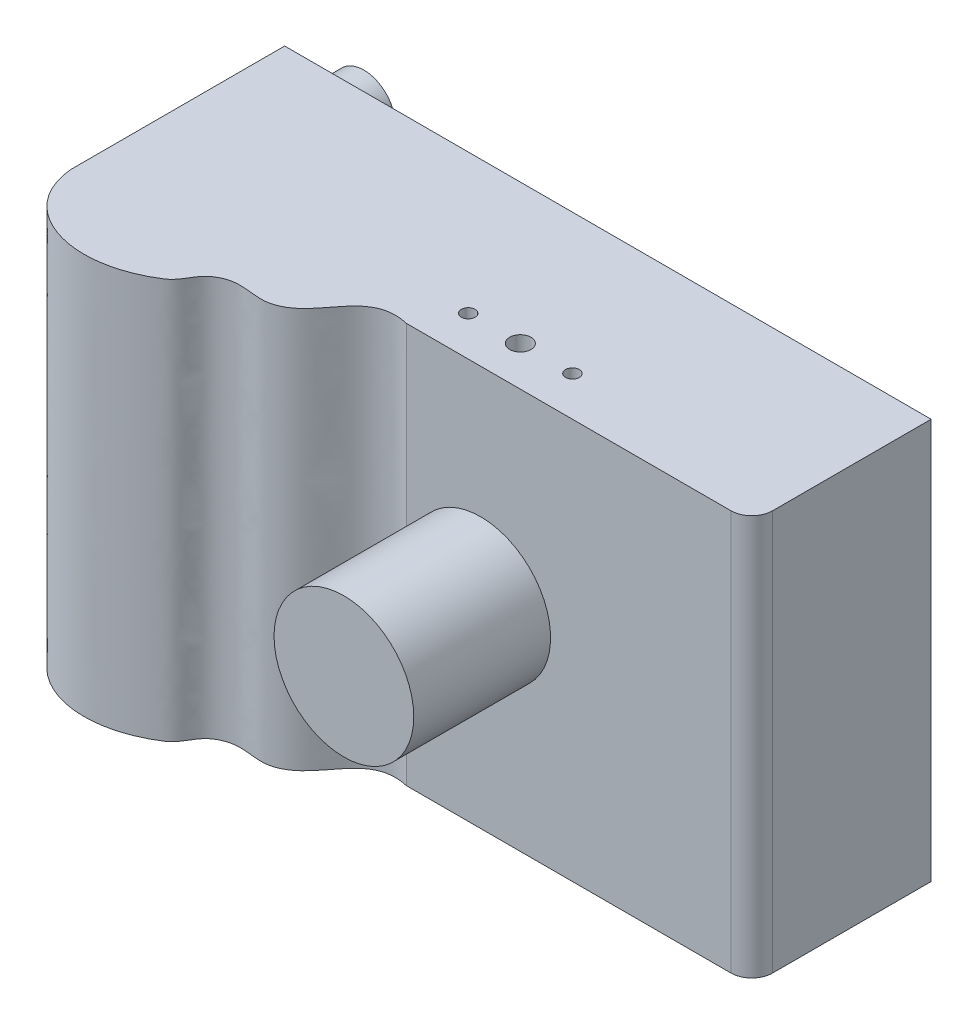
ISO-10303-21;
HEADER;
FILE_DESCRIPTION(('STEP AP214'),'2;1');
FILE_NAME('part.step','',(''),(''),'','','');
FILE_SCHEMA(('AUTOMOTIVE_DESIGN { 1 0 10303 214 1 1 1 1 }'));
ENDSEC;
DATA;
#1=APPLICATION_CONTEXT('core data for automotive mechanical design processes');
#2=APPLICATION_PROTOCOL_DEFINITION('international standard','automotive_design',2000,#1);
#3=PRODUCT_CONTEXT('',#1,'mechanical');
#4=PRODUCT('Part','Part','',(#3));
#5=PRODUCT_RELATED_PRODUCT_CATEGORY('part','',(#4));
#6=PRODUCT_DEFINITION_FORMATION('','',#4);
#7=PRODUCT_DEFINITION_CONTEXT('part definition',#1,'design');
#8=PRODUCT_DEFINITION('design','',#6,#7);
#9=PRODUCT_DEFINITION_SHAPE('','',#8);
#10=(LENGTH_UNIT() NAMED_UNIT(*) SI_UNIT(.MILLI.,.METRE.));
#11=(NAMED_UNIT(*) PLANE_ANGLE_UNIT() SI_UNIT($,.RADIAN.));
#12=(NAMED_UNIT(*) SI_UNIT($,.STERADIAN.) SOLID_ANGLE_UNIT());
#13=UNCERTAINTY_MEASURE_WITH_UNIT(LENGTH_MEASURE(1.E-05),#10,'distance_accuracy_value','');
#14=(GEOMETRIC_REPRESENTATION_CONTEXT(3) GLOBAL_UNCERTAINTY_ASSIGNED_CONTEXT((#13)) GLOBAL_UNIT_ASSIGNED_CONTEXT((#10,
#11,#12)) REPRESENTATION_CONTEXT('',''));
#15=CARTESIAN_POINT('',(0.,0.,0.));
#16=DIRECTION('',(0.,0.,1.));
#17=DIRECTION('',(1.,0.,0.));
#18=AXIS2_PLACEMENT_3D('',#15,#16,#17);
#19=CARTESIAN_POINT('',(-77.5,96.,-33.7133745413593));
#20=DIRECTION('',(1.,0.,0.));
#21=DIRECTION('',(0.,0.,-1.));
#22=AXIS2_PLACEMENT_3D('',#19,#20,#21);
#23=PLANE('',#22);
#24=CARTESIAN_POINT('',(-77.5,85.,-0.213374541359251));
#25=DIRECTION('',(-1.,0.,0.));
#26=DIRECTION('',(0.,0.,1.));
#27=AXIS2_PLACEMENT_3D('',#24,#25,#26);
#28=CIRCLE('',#27,1.65);
#29=CARTESIAN_POINT('',(-77.5,85.,1.43662545864075));
#30=VERTEX_POINT('',#29);
#31=EDGE_CURVE('E208',#30,#30,#28,.T.);
#32=ORIENTED_EDGE('',*,*,#31,.F.);
#33=EDGE_LOOP('',(#32));
#34=FACE_BOUND('',#33,.T.);
#35=CARTESIAN_POINT('',(-77.5,10.,-0.213374541359251));
#36=DIRECTION('',(-1.,0.,0.));
#37=DIRECTION('',(0.,0.,1.));
#38=AXIS2_PLACEMENT_3D('',#35,#36,#37);
#39=CIRCLE('',#38,1.65);
#40=CARTESIAN_POINT('',(-77.5,10.,1.43662545864075));
#41=VERTEX_POINT('',#40);
#42=EDGE_CURVE('E212',#41,#41,#39,.T.);
#43=ORIENTED_EDGE('',*,*,#42,.F.);
#44=EDGE_LOOP('',(#43));
#45=FACE_BOUND('',#44,.T.);
#46=CARTESIAN_POINT('',(-77.5,47.5,-0.213374541359251));
#47=DIRECTION('',(-1.,0.,0.));
#48=DIRECTION('',(0.,0.,1.));
#49=AXIS2_PLACEMENT_3D('',#46,#47,#48);
#50=CIRCLE('',#49,2.5527);
#51=CARTESIAN_POINT('',(-77.5,47.5,2.33932545864075));
#52=VERTEX_POINT('',#51);
#53=EDGE_CURVE('E215',#52,#52,#50,.T.);
#54=ORIENTED_EDGE('',*,*,#53,.F.);
#55=EDGE_LOOP('',(#54));
#56=FACE_BOUND('',#55,.T.);
#57=DIRECTION('',(0.,0.,1.));
#58=VECTOR('',#57,1.);
#59=CARTESIAN_POINT('',(-77.5,0.,-33.7133745413593));
#60=LINE('',#59,#58);
#61=CARTESIAN_POINT('',(-77.5,0.,-33.7133745413593));
#62=VERTEX_POINT('',#61);
#63=CARTESIAN_POINT('',(-77.5,0.,17.5926323335898));
#64=VERTEX_POINT('',#63);
#65=EDGE_CURVE('E134',#62,#64,#60,.T.);
#66=ORIENTED_EDGE('',*,*,#65,.T.);
#67=DIRECTION('',(0.,-1.,0.));
#68=VECTOR('',#67,1.);
#69=CARTESIAN_POINT('',(-77.5,96.,17.5926323335898));
#70=LINE('',#69,#68);
#71=CARTESIAN_POINT('',(-77.5,96.,17.5926323335898));
#72=VERTEX_POINT('',#71);
#73=EDGE_CURVE('E167',#72,#64,#70,.T.);
#74=ORIENTED_EDGE('',*,*,#73,.F.);
#75=DIRECTION('',(0.,0.,1.));
#76=VECTOR('',#75,1.);
#77=CARTESIAN_POINT('',(-77.5,96.,-33.7133745413593));
#78=LINE('',#77,#76);
#79=CARTESIAN_POINT('',(-77.5,96.,-33.7133745413593));
#80=VERTEX_POINT('',#79);
#81=EDGE_CURVE('E156',#80,#72,#78,.T.);
#82=ORIENTED_EDGE('',*,*,#81,.F.);
#83=DIRECTION('',(0.,-1.,0.));
#84=VECTOR('',#83,1.);
#85=CARTESIAN_POINT('',(-77.5,96.,-33.7133745413593));
#86=LINE('',#85,#84);
#87=EDGE_CURVE('E130',#80,#62,#86,.T.);
#88=ORIENTED_EDGE('',*,*,#87,.T.);
#89=EDGE_LOOP('',(#66,#74,#82,#88));
#90=FACE_BOUND('',#89,.T.);
#91=ADVANCED_FACE('F41',(#34,#45,#56,#90),#23,.F.);
#92=CARTESIAN_POINT('',(-77.5,96.,17.5926323335898));
#93=CARTESIAN_POINT('',(-76.5315869213499,96.,27.8123647059784));
#94=CARTESIAN_POINT('',(-63.183365133086,96.,36.2255266432069));
#95=CARTESIAN_POINT('',(-48.309869967326,96.,32.1915608013237));
#96=CARTESIAN_POINT('',(-41.5482213944993,96.,27.7915772785993));
#97=CARTESIAN_POINT('',(-39.9233173070363,96.,23.2528904065731));
#98=CARTESIAN_POINT('',(-33.5165916900151,96.,20.4028040792528));
#99=CARTESIAN_POINT('',(-27.63682193127,96.,22.4572797434264));
#100=CARTESIAN_POINT('',(-17.0164943439837,96.,17.9926335701171));
#101=CARTESIAN_POINT('',(-15.4514686909685,96.,6.93162842245507));
#102=CARTESIAN_POINT('',(-5.34280428989304,96.,9.28662545864075));
#103=B_SPLINE_CURVE_WITH_KNOTS('',3,(#92,#93,#94,#95,#96,#97,#98,#99,#100,#101,#102),
.UNSPECIFIED.,.F.,.F.,(4,1,1,1,1,1,1,1,4),(0.,0.287416321184305,0.468367966268484,
0.496457190712018,0.560076212974291,0.621962161595388,0.714917343398647,0.759402269594199,1.),.UNSPECIFIED.);
#104=DIRECTION('',(0.,-1.,0.));
#105=VECTOR('',#104,1.);
#106=SURFACE_OF_LINEAR_EXTRUSION('',#103,#105);
#107=CARTESIAN_POINT('',(-77.5,0.,17.5926323335898));
#108=CARTESIAN_POINT('',(-76.5315869213499,0.,27.8123647059784));
#109=CARTESIAN_POINT('',(-63.183365133086,0.,36.2255266432069));
#110=CARTESIAN_POINT('',(-48.309869967326,0.,32.1915608013237));
#111=CARTESIAN_POINT('',(-41.5482213944993,0.,27.7915772785993));
#112=CARTESIAN_POINT('',(-39.9233173070363,0.,23.2528904065731));
#113=CARTESIAN_POINT('',(-33.5165916900151,0.,20.4028040792528));
#114=CARTESIAN_POINT('',(-27.63682193127,0.,22.4572797434264));
#115=CARTESIAN_POINT('',(-17.0164943439837,0.,17.9926335701171));
#116=CARTESIAN_POINT('',(-15.4514686909685,0.,6.93162842245507));
#117=CARTESIAN_POINT('',(-5.34280428989304,0.,9.28662545864075));
#118=B_SPLINE_CURVE_WITH_KNOTS('',3,(#107,#108,#109,#110,#111,#112,#113,#114,#115,#116,#117),
.UNSPECIFIED.,.F.,.F.,(4,1,1,1,1,1,1,1,4),(0.,0.287416321184305,0.468367966268484,
0.496457190712018,0.560076212974291,0.621962161595388,0.714917343398647,0.759402269594199,1.),.UNSPECIFIED.);
#119=CARTESIAN_POINT('',(-5.34280428989305,0.,9.28662545864074));
#120=VERTEX_POINT('',#119);
#121=EDGE_CURVE('E138',#64,#120,#118,.T.);
#122=ORIENTED_EDGE('',*,*,#121,.T.);
#123=DIRECTION('',(0.,-1.,0.));
#124=VECTOR('',#123,1.);
#125=CARTESIAN_POINT('',(-5.34280428989305,96.,9.28662545864074));
#126=LINE('',#125,#124);
#127=CARTESIAN_POINT('',(-5.34280428989305,96.,9.28662545864074));
#128=VERTEX_POINT('',#127);
#129=EDGE_CURVE('E163',#128,#120,#126,.T.);
#130=ORIENTED_EDGE('',*,*,#129,.F.);
#131=EDGE_CURVE('E97',#72,#128,#103,.T.);
#132=ORIENTED_EDGE('',*,*,#131,.F.);
#133=ORIENTED_EDGE('',*,*,#73,.T.);
#134=EDGE_LOOP('',(#122,#130,#132,#133));
#135=FACE_BOUND('',#134,.T.);
#136=ADVANCED_FACE('F178',(#135),#106,.F.);
#137=CARTESIAN_POINT('',(72.5,96.,9.28662545864074));
#138=DIRECTION('',(0.,0.,-1.));
#139=DIRECTION('',(-1.,0.,0.));
#140=AXIS2_PLACEMENT_3D('',#137,#138,#139);
#141=PLANE('',#140);
#142=CARTESIAN_POINT('',(12.5,48.,9.28662545864074));
#143=DIRECTION('',(0.,0.,-1.));
#144=DIRECTION('',(-1.,0.,0.));
#145=AXIS2_PLACEMENT_3D('',#142,#143,#144);
#146=CIRCLE('',#145,16.75);
#147=CARTESIAN_POINT('',(-4.25,48.,9.28662545864074));
#148=VERTEX_POINT('',#147);
#149=EDGE_CURVE('E50',#148,#148,#146,.F.);
#150=ORIENTED_EDGE('',*,*,#149,.F.);
#151=EDGE_LOOP('',(#150));
#152=FACE_BOUND('',#151,.T.);
#153=DIRECTION('',(1.,0.,0.));
#154=VECTOR('',#153,1.);
#155=CARTESIAN_POINT('',(72.5,0.,9.28662545864074));
#156=LINE('',#155,#154);
#157=CARTESIAN_POINT('',(72.5,0.,9.28662545864075));
#158=VERTEX_POINT('',#157);
#159=EDGE_CURVE('E144',#120,#158,#156,.T.);
#160=ORIENTED_EDGE('',*,*,#159,.T.);
#161=DIRECTION('',(0.,-1.,0.));
#162=VECTOR('',#161,1.);
#163=CARTESIAN_POINT('',(72.5,96.,9.28662545864075));
#164=LINE('',#163,#162);
#165=CARTESIAN_POINT('',(72.5,96.,9.28662545864075));
#166=VERTEX_POINT('',#165);
#167=EDGE_CURVE('E123',#166,#158,#164,.T.);
#168=ORIENTED_EDGE('',*,*,#167,.F.);
#169=DIRECTION('',(1.,0.,0.));
#170=VECTOR('',#169,1.);
#171=CARTESIAN_POINT('',(72.5,96.,9.28662545864074));
#172=LINE('',#171,#170);
#173=EDGE_CURVE('E112',#128,#166,#172,.T.);
#174=ORIENTED_EDGE('',*,*,#173,.F.);
#175=ORIENTED_EDGE('',*,*,#129,.T.);
#176=EDGE_LOOP('',(#160,#168,#174,#175));
#177=FACE_BOUND('',#176,.T.);
#178=ADVANCED_FACE('F175',(#152,#177),#141,.F.);
#179=CARTESIAN_POINT('',(72.5,96.,4.28662545864075));
#180=DIRECTION('',(0.,-1.,0.));
#181=DIRECTION('',(0.,0.,-1.));
#182=AXIS2_PLACEMENT_3D('',#179,#180,#181);
#183=CYLINDRICAL_SURFACE('',#182,5.);
#184=CARTESIAN_POINT('',(72.5,0.,4.28662545864075));
#185=DIRECTION('',(0.,1.,0.));
#186=DIRECTION('',(0.,0.,1.));
#187=AXIS2_PLACEMENT_3D('',#184,#185,#186);
#188=CIRCLE('',#187,5.);
#189=CARTESIAN_POINT('',(77.5,0.,4.28662545864074));
#190=VERTEX_POINT('',#189);
#191=EDGE_CURVE('E121',#158,#190,#188,.T.);
#192=ORIENTED_EDGE('',*,*,#191,.T.);
#193=DIRECTION('',(0.,-1.,0.));
#194=VECTOR('',#193,1.);
#195=CARTESIAN_POINT('',(77.5,96.,4.28662545864074));
#196=LINE('',#195,#194);
#197=CARTESIAN_POINT('',(77.5,96.,4.28662545864074));
#198=VERTEX_POINT('',#197);
#199=EDGE_CURVE('E118',#198,#190,#196,.T.);
#200=ORIENTED_EDGE('',*,*,#199,.F.);
#201=CARTESIAN_POINT('',(72.5,96.,4.28662545864075));
#202=DIRECTION('',(0.,1.,0.));
#203=DIRECTION('',(0.,0.,1.));
#204=AXIS2_PLACEMENT_3D('',#201,#202,#203);
#205=CIRCLE('',#204,5.);
#206=EDGE_CURVE('E106',#166,#198,#205,.T.);
#207=ORIENTED_EDGE('',*,*,#206,.F.);
#208=ORIENTED_EDGE('',*,*,#167,.T.);
#209=EDGE_LOOP('',(#192,#200,#207,#208));
#210=FACE_BOUND('',#209,.T.);
#211=ADVANCED_FACE('F119',(#210),#183,.T.);
#212=CARTESIAN_POINT('',(77.5,96.,-33.7133745413593));
#213=DIRECTION('',(-1.,0.,0.));
#214=DIRECTION('',(0.,0.,1.));
#215=AXIS2_PLACEMENT_3D('',#212,#213,#214);
#216=PLANE('',#215);
#217=DIRECTION('',(0.,0.,-1.));
#218=VECTOR('',#217,1.);
#219=CARTESIAN_POINT('',(77.5,0.,-33.7133745413593));
#220=LINE('',#219,#218);
#221=CARTESIAN_POINT('',(77.5,0.,-33.7133745413593));
#222=VERTEX_POINT('',#221);
#223=EDGE_CURVE('E82',#190,#222,#220,.T.);
#224=ORIENTED_EDGE('',*,*,#223,.T.);
#225=DIRECTION('',(0.,-1.,0.));
#226=VECTOR('',#225,1.);
#227=CARTESIAN_POINT('',(77.5,96.,-33.7133745413593));
#228=LINE('',#227,#226);
#229=CARTESIAN_POINT('',(77.5,96.,-33.7133745413593));
#230=VERTEX_POINT('',#229);
#231=EDGE_CURVE('E124',#230,#222,#228,.T.);
#232=ORIENTED_EDGE('',*,*,#231,.F.);
#233=DIRECTION('',(0.,0.,-1.));
#234=VECTOR('',#233,1.);
#235=CARTESIAN_POINT('',(77.5,96.,-33.7133745413593));
#236=LINE('',#235,#234);
#237=EDGE_CURVE('E110',#198,#230,#236,.T.);
#238=ORIENTED_EDGE('',*,*,#237,.F.);
#239=ORIENTED_EDGE('',*,*,#199,.T.);
#240=EDGE_LOOP('',(#224,#232,#238,#239));
#241=FACE_BOUND('',#240,.T.);
#242=ADVANCED_FACE('F126',(#241),#216,.F.);
#243=CARTESIAN_POINT('',(-77.5,96.,-33.7133745413593));
#244=DIRECTION('',(0.,0.,1.));
#245=DIRECTION('',(1.,0.,0.));
#246=AXIS2_PLACEMENT_3D('',#243,#244,#245);
#247=PLANE('',#246);
#248=CARTESIAN_POINT('',(-66.5,85.,-33.7133745413593));
#249=DIRECTION('',(0.,0.,1.));
#250=DIRECTION('',(1.,0.,0.));
#251=AXIS2_PLACEMENT_3D('',#248,#249,#250);
#252=CIRCLE('',#251,7.50000000000001);
#253=CARTESIAN_POINT('',(-59.,85.,-33.7133745413593));
#254=VERTEX_POINT('',#253);
#255=EDGE_CURVE('E11',#254,#254,#252,.F.);
#256=ORIENTED_EDGE('',*,*,#255,.F.);
#257=EDGE_LOOP('',(#256));
#258=FACE_BOUND('',#257,.T.);
#259=DIRECTION('',(-1.,0.,0.));
#260=VECTOR('',#259,1.);
#261=CARTESIAN_POINT('',(-77.5,0.,-33.7133745413593));
#262=LINE('',#261,#260);
#263=EDGE_CURVE('E88',#222,#62,#262,.T.);
#264=ORIENTED_EDGE('',*,*,#263,.T.);
#265=ORIENTED_EDGE('',*,*,#87,.F.);
#266=DIRECTION('',(-1.,0.,0.));
#267=VECTOR('',#266,1.);
#268=CARTESIAN_POINT('',(-77.5,96.,-33.7133745413593));
#269=LINE('',#268,#267);
#270=EDGE_CURVE('E58',#230,#80,#269,.T.);
#271=ORIENTED_EDGE('',*,*,#270,.F.);
#272=ORIENTED_EDGE('',*,*,#231,.T.);
#273=EDGE_LOOP('',(#264,#265,#271,#272));
#274=FACE_BOUND('',#273,.T.);
#275=ADVANCED_FACE('F187',(#258,#274),#247,.F.);
#276=CARTESIAN_POINT('',(-42.3399997701735,96.,28.0290470153399));
#277=DIRECTION('',(0.,-1.,0.));
#278=DIRECTION('',(0.,0.,-1.));
#279=AXIS2_PLACEMENT_3D('',#276,#277,#278);
#280=PLANE('',#279);
#281=CARTESIAN_POINT('',(25.,96.,-0.213374541359251));
#282=DIRECTION('',(0.,1.,0.));
#283=DIRECTION('',(0.,0.,1.));
#284=AXIS2_PLACEMENT_3D('',#281,#282,#283);
#285=CIRCLE('',#284,1.65);
#286=CARTESIAN_POINT('',(25.,96.,1.43662545864075));
#287=VERTEX_POINT('',#286);
#288=EDGE_CURVE('E515',#287,#287,#285,.T.);
#289=ORIENTED_EDGE('',*,*,#288,.F.);
#290=EDGE_LOOP('',(#289));
#291=FACE_BOUND('',#290,.T.);
#292=CARTESIAN_POINT('',(0.,96.,-0.213374541359251));
#293=DIRECTION('',(0.,1.,0.));
#294=DIRECTION('',(0.,0.,1.));
#295=AXIS2_PLACEMENT_3D('',#292,#293,#294);
#296=CIRCLE('',#295,1.65);
#297=CARTESIAN_POINT('',(0.,96.,1.43662545864075));
#298=VERTEX_POINT('',#297);
#299=EDGE_CURVE('E525',#298,#298,#296,.T.);
#300=ORIENTED_EDGE('',*,*,#299,.F.);
#301=EDGE_LOOP('',(#300));
#302=FACE_BOUND('',#301,.T.);
#303=CARTESIAN_POINT('',(12.5,96.,-0.213374541359251));
#304=DIRECTION('',(0.,1.,0.));
#305=DIRECTION('',(0.,0.,1.));
#306=AXIS2_PLACEMENT_3D('',#303,#304,#305);
#307=CIRCLE('',#306,2.5527);
#308=CARTESIAN_POINT('',(12.5,96.,2.33932545864075));
#309=VERTEX_POINT('',#308);
#310=EDGE_CURVE('E533',#309,#309,#307,.T.);
#311=ORIENTED_EDGE('',*,*,#310,.F.);
#312=EDGE_LOOP('',(#311));
#313=FACE_BOUND('',#312,.T.);
#314=ORIENTED_EDGE('',*,*,#81,.T.);
#315=ORIENTED_EDGE('',*,*,#131,.T.);
#316=ORIENTED_EDGE('',*,*,#173,.T.);
#317=ORIENTED_EDGE('',*,*,#206,.T.);
#318=ORIENTED_EDGE('',*,*,#237,.T.);
#319=ORIENTED_EDGE('',*,*,#270,.T.);
#320=EDGE_LOOP('',(#314,#315,#316,#317,#318,#319));
#321=FACE_BOUND('',#320,.T.);
#322=ADVANCED_FACE('F108',(#291,#302,#313,#321),#280,.F.);
#323=CARTESIAN_POINT('',(-42.3399997701735,0.,28.0290470153399));
#324=DIRECTION('',(0.,-1.,0.));
#325=DIRECTION('',(0.,0.,-1.));
#326=AXIS2_PLACEMENT_3D('',#323,#324,#325);
#327=PLANE('',#326);
#328=CARTESIAN_POINT('',(0.,0.,-0.213374541359251));
#329=DIRECTION('',(0.,-1.,0.));
#330=DIRECTION('',(0.,0.,-1.));
#331=AXIS2_PLACEMENT_3D('',#328,#329,#330);
#332=CIRCLE('',#331,1.65);
#333=CARTESIAN_POINT('',(0.,0.,-1.86337454135925));
#334=VERTEX_POINT('',#333);
#335=EDGE_CURVE('E541',#334,#334,#332,.T.);
#336=ORIENTED_EDGE('',*,*,#335,.F.);
#337=EDGE_LOOP('',(#336));
#338=FACE_BOUND('',#337,.T.);
#339=CARTESIAN_POINT('',(25.,0.,-0.213374541359251));
#340=DIRECTION('',(0.,-1.,0.));
#341=DIRECTION('',(0.,0.,-1.));
#342=AXIS2_PLACEMENT_3D('',#339,#340,#341);
#343=CIRCLE('',#342,1.65);
#344=CARTESIAN_POINT('',(25.,0.,-1.86337454135925));
#345=VERTEX_POINT('',#344);
#346=EDGE_CURVE('E549',#345,#345,#343,.T.);
#347=ORIENTED_EDGE('',*,*,#346,.F.);
#348=EDGE_LOOP('',(#347));
#349=FACE_BOUND('',#348,.T.);
#350=CARTESIAN_POINT('',(12.5,0.,-10.2133745413593));
#351=DIRECTION('',(0.,-1.,0.));
#352=DIRECTION('',(0.,0.,-1.));
#353=AXIS2_PLACEMENT_3D('',#350,#351,#352);
#354=CIRCLE('',#353,2.5527);
#355=CARTESIAN_POINT('',(12.5,0.,-12.7660745413593));
#356=VERTEX_POINT('',#355);
#357=EDGE_CURVE('E557',#356,#356,#354,.T.);
#358=ORIENTED_EDGE('',*,*,#357,.F.);
#359=EDGE_LOOP('',(#358));
#360=FACE_BOUND('',#359,.T.);
#361=ORIENTED_EDGE('',*,*,#65,.F.);
#362=ORIENTED_EDGE('',*,*,#263,.F.);
#363=ORIENTED_EDGE('',*,*,#223,.F.);
#364=ORIENTED_EDGE('',*,*,#191,.F.);
#365=ORIENTED_EDGE('',*,*,#159,.F.);
#366=ORIENTED_EDGE('',*,*,#121,.F.);
#367=EDGE_LOOP('',(#361,#362,#363,#364,#365,#366));
#368=FACE_BOUND('',#367,.T.);
#369=ADVANCED_FACE('F183',(#338,#349,#360,#368),#327,.T.);
#370=CARTESIAN_POINT('',(-65.69,47.5,-0.213374541359251));
#371=DIRECTION('',(-1.,0.,0.));
#372=DIRECTION('',(0.,0.,1.));
#373=AXIS2_PLACEMENT_3D('',#370,#371,#372);
#374=CONICAL_SURFACE('',#373,2.5527,1.02974425867666);
#375=CARTESIAN_POINT('',(-64.1561830978084,47.5,-0.213374541359251));
#376=VERTEX_POINT('',#375);
#377=VERTEX_LOOP('',#376);
#378=FACE_BOUND('',#377,.T.);
#379=CARTESIAN_POINT('',(-65.69,47.5,-0.213374541359251));
#380=DIRECTION('',(-1.,0.,0.));
#381=DIRECTION('',(0.,0.,1.));
#382=AXIS2_PLACEMENT_3D('',#379,#380,#381);
#383=CIRCLE('',#382,2.5527);
#384=CARTESIAN_POINT('',(-65.69,47.5,2.33932545864075));
#385=VERTEX_POINT('',#384);
#386=EDGE_CURVE('E139',#385,#385,#383,.T.);
#387=ORIENTED_EDGE('',*,*,#386,.T.);
#388=EDGE_LOOP('',(#387));
#389=FACE_BOUND('',#388,.T.);
#390=ADVANCED_FACE('F254',(#378,#389),#374,.F.);
#391=CARTESIAN_POINT('',(-77.5,47.5,-0.213374541359251));
#392=DIRECTION('',(-1.,0.,0.));
#393=DIRECTION('',(0.,0.,1.));
#394=AXIS2_PLACEMENT_3D('',#391,#392,#393);
#395=CYLINDRICAL_SURFACE('',#394,2.5527);
#396=ORIENTED_EDGE('',*,*,#386,.F.);
#397=EDGE_LOOP('',(#396));
#398=FACE_BOUND('',#397,.T.);
#399=ORIENTED_EDGE('',*,*,#53,.T.);
#400=EDGE_LOOP('',(#399));
#401=FACE_BOUND('',#400,.T.);
#402=ADVANCED_FACE('F259',(#398,#401),#395,.F.);
#403=CARTESIAN_POINT('',(-69.5,10.,-0.213374541359251));
#404=DIRECTION('',(-1.,0.,0.));
#405=DIRECTION('',(0.,0.,1.));
#406=AXIS2_PLACEMENT_3D('',#403,#404,#405);
#407=CONICAL_SURFACE('',#406,1.65,1.02974425867665);
#408=CARTESIAN_POINT('',(-68.5085799786045,10.,-0.213374541359251));
#409=VERTEX_POINT('',#408);
#410=VERTEX_LOOP('',#409);
#411=FACE_BOUND('',#410,.T.);
#412=CARTESIAN_POINT('',(-69.5,10.,-0.213374541359251));
#413=DIRECTION('',(-1.,0.,0.));
#414=DIRECTION('',(0.,0.,1.));
#415=AXIS2_PLACEMENT_3D('',#412,#413,#414);
#416=CIRCLE('',#415,1.65);
#417=CARTESIAN_POINT('',(-69.5,10.,1.43662545864075));
#418=VERTEX_POINT('',#417);
#419=EDGE_CURVE('E218',#418,#418,#416,.T.);
#420=ORIENTED_EDGE('',*,*,#419,.T.);
#421=EDGE_LOOP('',(#420));
#422=FACE_BOUND('',#421,.T.);
#423=ADVANCED_FACE('F271',(#411,#422),#407,.F.);
#424=CARTESIAN_POINT('',(-77.5,10.,-0.213374541359251));
#425=DIRECTION('',(-1.,0.,0.));
#426=DIRECTION('',(0.,0.,1.));
#427=AXIS2_PLACEMENT_3D('',#424,#425,#426);
#428=CYLINDRICAL_SURFACE('',#427,1.65);
#429=ORIENTED_EDGE('',*,*,#419,.F.);
#430=EDGE_LOOP('',(#429));
#431=FACE_BOUND('',#430,.T.);
#432=ORIENTED_EDGE('',*,*,#42,.T.);
#433=EDGE_LOOP('',(#432));
#434=FACE_BOUND('',#433,.T.);
#435=ADVANCED_FACE('F288',(#431,#434),#428,.F.);
#436=CARTESIAN_POINT('',(-69.5,85.,-0.213374541359251));
#437=DIRECTION('',(-1.,0.,0.));
#438=DIRECTION('',(0.,0.,1.));
#439=AXIS2_PLACEMENT_3D('',#436,#437,#438);
#440=CONICAL_SURFACE('',#439,1.65,1.02974425867665);
#441=CARTESIAN_POINT('',(-68.5085799786045,85.,-0.213374541359251));
#442=VERTEX_POINT('',#441);
#443=VERTEX_LOOP('',#442);
#444=FACE_BOUND('',#443,.T.);
#445=CARTESIAN_POINT('',(-69.5,85.,-0.213374541359251));
#446=DIRECTION('',(-1.,0.,0.));
#447=DIRECTION('',(0.,0.,1.));
#448=AXIS2_PLACEMENT_3D('',#445,#446,#447);
#449=CIRCLE('',#448,1.65);
#450=CARTESIAN_POINT('',(-69.5,85.,1.43662545864075));
#451=VERTEX_POINT('',#450);
#452=EDGE_CURVE('E567',#451,#451,#449,.T.);
#453=ORIENTED_EDGE('',*,*,#452,.T.);
#454=EDGE_LOOP('',(#453));
#455=FACE_BOUND('',#454,.T.);
#456=ADVANCED_FACE('F299',(#444,#455),#440,.F.);
#457=CARTESIAN_POINT('',(-77.5,85.,-0.213374541359251));
#458=DIRECTION('',(-1.,0.,0.));
#459=DIRECTION('',(0.,0.,1.));
#460=AXIS2_PLACEMENT_3D('',#457,#458,#459);
#461=CYLINDRICAL_SURFACE('',#460,1.65);
#462=ORIENTED_EDGE('',*,*,#452,.F.);
#463=EDGE_LOOP('',(#462));
#464=FACE_BOUND('',#463,.T.);
#465=ORIENTED_EDGE('',*,*,#31,.T.);
#466=EDGE_LOOP('',(#465));
#467=FACE_BOUND('',#466,.T.);
#468=ADVANCED_FACE('F310',(#464,#467),#461,.F.);
#469=CARTESIAN_POINT('',(12.5,8.,-10.2133745413593));
#470=DIRECTION('',(0.,-1.,0.));
#471=DIRECTION('',(0.,0.,-1.));
#472=AXIS2_PLACEMENT_3D('',#469,#470,#471);
#473=CONICAL_SURFACE('',#472,2.5527,1.02974425867665);
#474=CARTESIAN_POINT('',(12.5,9.53381690219165,-10.2133745413593));
#475=VERTEX_POINT('',#474);
#476=VERTEX_LOOP('',#475);
#477=FACE_BOUND('',#476,.T.);
#478=CARTESIAN_POINT('',(12.5,8.,-10.2133745413593));
#479=DIRECTION('',(0.,-1.,0.));
#480=DIRECTION('',(0.,0.,-1.));
#481=AXIS2_PLACEMENT_3D('',#478,#479,#480);
#482=CIRCLE('',#481,2.5527);
#483=CARTESIAN_POINT('',(12.5,8.,-12.7660745413593));
#484=VERTEX_POINT('',#483);
#485=EDGE_CURVE('E561',#484,#484,#482,.T.);
#486=ORIENTED_EDGE('',*,*,#485,.T.);
#487=EDGE_LOOP('',(#486));
#488=FACE_BOUND('',#487,.T.);
#489=ADVANCED_FACE('F320',(#477,#488),#473,.F.);
#490=CARTESIAN_POINT('',(12.5,0.,-10.2133745413593));
#491=DIRECTION('',(0.,-1.,0.));
#492=DIRECTION('',(0.,0.,-1.));
#493=AXIS2_PLACEMENT_3D('',#490,#491,#492);
#494=CYLINDRICAL_SURFACE('',#493,2.5527);
#495=ORIENTED_EDGE('',*,*,#485,.F.);
#496=EDGE_LOOP('',(#495));
#497=FACE_BOUND('',#496,.T.);
#498=ORIENTED_EDGE('',*,*,#357,.T.);
#499=EDGE_LOOP('',(#498));
#500=FACE_BOUND('',#499,.T.);
#501=ADVANCED_FACE('F330',(#497,#500),#494,.F.);
#502=CARTESIAN_POINT('',(25.,8.,-0.213374541359251));
#503=DIRECTION('',(0.,-1.,0.));
#504=DIRECTION('',(0.,0.,-1.));
#505=AXIS2_PLACEMENT_3D('',#502,#503,#504);
#506=CONICAL_SURFACE('',#505,1.65,1.02974425867665);
#507=CARTESIAN_POINT('',(25.,8.99142002139548,-0.213374541359251));
#508=VERTEX_POINT('',#507);
#509=VERTEX_LOOP('',#508);
#510=FACE_BOUND('',#509,.T.);
#511=CARTESIAN_POINT('',(25.,8.,-0.213374541359251));
#512=DIRECTION('',(0.,-1.,0.));
#513=DIRECTION('',(0.,0.,-1.));
#514=AXIS2_PLACEMENT_3D('',#511,#512,#513);
#515=CIRCLE('',#514,1.65);
#516=CARTESIAN_POINT('',(25.,8.,-1.86337454135925));
#517=VERTEX_POINT('',#516);
#518=EDGE_CURVE('E553',#517,#517,#515,.T.);
#519=ORIENTED_EDGE('',*,*,#518,.T.);
#520=EDGE_LOOP('',(#519));
#521=FACE_BOUND('',#520,.T.);
#522=ADVANCED_FACE('F340',(#510,#521),#506,.F.);
#523=CARTESIAN_POINT('',(25.,0.,-0.213374541359251));
#524=DIRECTION('',(0.,-1.,0.));
#525=DIRECTION('',(0.,0.,-1.));
#526=AXIS2_PLACEMENT_3D('',#523,#524,#525);
#527=CYLINDRICAL_SURFACE('',#526,1.65);
#528=ORIENTED_EDGE('',*,*,#518,.F.);
#529=EDGE_LOOP('',(#528));
#530=FACE_BOUND('',#529,.T.);
#531=ORIENTED_EDGE('',*,*,#346,.T.);
#532=EDGE_LOOP('',(#531));
#533=FACE_BOUND('',#532,.T.);
#534=ADVANCED_FACE('F358',(#530,#533),#527,.F.);
#535=CARTESIAN_POINT('',(0.,8.,-0.213374541359251));
#536=DIRECTION('',(0.,-1.,0.));
#537=DIRECTION('',(0.,0.,-1.));
#538=AXIS2_PLACEMENT_3D('',#535,#536,#537);
#539=CONICAL_SURFACE('',#538,1.65,1.02974425867665);
#540=CARTESIAN_POINT('',(0.,8.99142002139548,-0.213374541359251));
#541=VERTEX_POINT('',#540);
#542=VERTEX_LOOP('',#541);
#543=FACE_BOUND('',#542,.T.);
#544=CARTESIAN_POINT('',(0.,8.,-0.213374541359251));
#545=DIRECTION('',(0.,-1.,0.));
#546=DIRECTION('',(0.,0.,-1.));
#547=AXIS2_PLACEMENT_3D('',#544,#545,#546);
#548=CIRCLE('',#547,1.65);
#549=CARTESIAN_POINT('',(0.,8.,-1.86337454135925));
#550=VERTEX_POINT('',#549);
#551=EDGE_CURVE('E545',#550,#550,#548,.T.);
#552=ORIENTED_EDGE('',*,*,#551,.T.);
#553=EDGE_LOOP('',(#552));
#554=FACE_BOUND('',#553,.T.);
#555=ADVANCED_FACE('F369',(#543,#554),#539,.F.);
#556=CARTESIAN_POINT('',(0.,0.,-0.213374541359251));
#557=DIRECTION('',(0.,-1.,0.));
#558=DIRECTION('',(0.,0.,-1.));
#559=AXIS2_PLACEMENT_3D('',#556,#557,#558);
#560=CYLINDRICAL_SURFACE('',#559,1.65);
#561=ORIENTED_EDGE('',*,*,#551,.F.);
#562=EDGE_LOOP('',(#561));
#563=FACE_BOUND('',#562,.T.);
#564=ORIENTED_EDGE('',*,*,#335,.T.);
#565=EDGE_LOOP('',(#564));
#566=FACE_BOUND('',#565,.T.);
#567=ADVANCED_FACE('F380',(#563,#566),#560,.F.);
#568=CARTESIAN_POINT('',(12.5,88.,-0.213374541359251));
#569=DIRECTION('',(0.,1.,0.));
#570=DIRECTION('',(0.,0.,1.));
#571=AXIS2_PLACEMENT_3D('',#568,#569,#570);
#572=CONICAL_SURFACE('',#571,2.5527,1.02974425867666);
#573=CARTESIAN_POINT('',(12.5,86.4661830978083,-0.213374541359251));
#574=VERTEX_POINT('',#573);
#575=VERTEX_LOOP('',#574);
#576=FACE_BOUND('',#575,.T.);
#577=CARTESIAN_POINT('',(12.5,88.,-0.213374541359251));
#578=DIRECTION('',(0.,1.,0.));
#579=DIRECTION('',(0.,0.,1.));
#580=AXIS2_PLACEMENT_3D('',#577,#578,#579);
#581=CIRCLE('',#580,2.5527);
#582=CARTESIAN_POINT('',(12.5,88.,2.33932545864075));
#583=VERTEX_POINT('',#582);
#584=EDGE_CURVE('E537',#583,#583,#581,.T.);
#585=ORIENTED_EDGE('',*,*,#584,.T.);
#586=EDGE_LOOP('',(#585));
#587=FACE_BOUND('',#586,.T.);
#588=ADVANCED_FACE('F390',(#576,#587),#572,.F.);
#589=CARTESIAN_POINT('',(12.5,96.,-0.213374541359251));
#590=DIRECTION('',(0.,1.,0.));
#591=DIRECTION('',(0.,0.,1.));
#592=AXIS2_PLACEMENT_3D('',#589,#590,#591);
#593=CYLINDRICAL_SURFACE('',#592,2.5527);
#594=ORIENTED_EDGE('',*,*,#584,.F.);
#595=EDGE_LOOP('',(#594));
#596=FACE_BOUND('',#595,.T.);
#597=ORIENTED_EDGE('',*,*,#310,.T.);
#598=EDGE_LOOP('',(#597));
#599=FACE_BOUND('',#598,.T.);
#600=ADVANCED_FACE('F400',(#596,#599),#593,.F.);
#601=CARTESIAN_POINT('',(0.,88.,-0.213374541359251));
#602=DIRECTION('',(0.,1.,0.));
#603=DIRECTION('',(0.,0.,1.));
#604=AXIS2_PLACEMENT_3D('',#601,#602,#603);
#605=CONICAL_SURFACE('',#604,1.65,1.02974425867666);
#606=CARTESIAN_POINT('',(0.,87.0085799786045,-0.213374541359251));
#607=VERTEX_POINT('',#606);
#608=VERTEX_LOOP('',#607);
#609=FACE_BOUND('',#608,.T.);
#610=CARTESIAN_POINT('',(0.,88.,-0.213374541359251));
#611=DIRECTION('',(0.,1.,0.));
#612=DIRECTION('',(0.,0.,1.));
#613=AXIS2_PLACEMENT_3D('',#610,#611,#612);
#614=CIRCLE('',#613,1.65);
#615=CARTESIAN_POINT('',(0.,88.,1.43662545864075));
#616=VERTEX_POINT('',#615);
#617=EDGE_CURVE('E529',#616,#616,#614,.T.);
#618=ORIENTED_EDGE('',*,*,#617,.T.);
#619=EDGE_LOOP('',(#618));
#620=FACE_BOUND('',#619,.T.);
#621=ADVANCED_FACE('F410',(#609,#620),#605,.F.);
#622=CARTESIAN_POINT('',(0.,96.,-0.213374541359251));
#623=DIRECTION('',(0.,1.,0.));
#624=DIRECTION('',(0.,0.,1.));
#625=AXIS2_PLACEMENT_3D('',#622,#623,#624);
#626=CYLINDRICAL_SURFACE('',#625,1.65);
#627=ORIENTED_EDGE('',*,*,#617,.F.);
#628=EDGE_LOOP('',(#627));
#629=FACE_BOUND('',#628,.T.);
#630=ORIENTED_EDGE('',*,*,#299,.T.);
#631=EDGE_LOOP('',(#630));
#632=FACE_BOUND('',#631,.T.);
#633=ADVANCED_FACE('F426',(#629,#632),#626,.F.);
#634=CARTESIAN_POINT('',(25.,88.,-0.213374541359251));
#635=DIRECTION('',(0.,1.,0.));
#636=DIRECTION('',(0.,0.,1.));
#637=AXIS2_PLACEMENT_3D('',#634,#635,#636);
#638=CONICAL_SURFACE('',#637,1.65,1.02974425867666);
#639=CARTESIAN_POINT('',(25.,87.0085799786045,-0.213374541359251));
#640=VERTEX_POINT('',#639);
#641=VERTEX_LOOP('',#640);
#642=FACE_BOUND('',#641,.T.);
#643=CARTESIAN_POINT('',(25.,88.,-0.213374541359251));
#644=DIRECTION('',(0.,1.,0.));
#645=DIRECTION('',(0.,0.,1.));
#646=AXIS2_PLACEMENT_3D('',#643,#644,#645);
#647=CIRCLE('',#646,1.65);
#648=CARTESIAN_POINT('',(25.,88.,1.43662545864075));
#649=VERTEX_POINT('',#648);
#650=EDGE_CURVE('E521',#649,#649,#647,.T.);
#651=ORIENTED_EDGE('',*,*,#650,.T.);
#652=EDGE_LOOP('',(#651));
#653=FACE_BOUND('',#652,.T.);
#654=ADVANCED_FACE('F436',(#642,#653),#638,.F.);
#655=CARTESIAN_POINT('',(25.,96.,-0.213374541359251));
#656=DIRECTION('',(0.,1.,0.));
#657=DIRECTION('',(0.,0.,1.));
#658=AXIS2_PLACEMENT_3D('',#655,#656,#657);
#659=CYLINDRICAL_SURFACE('',#658,1.65);
#660=ORIENTED_EDGE('',*,*,#650,.F.);
#661=EDGE_LOOP('',(#660));
#662=FACE_BOUND('',#661,.T.);
#663=ORIENTED_EDGE('',*,*,#288,.T.);
#664=EDGE_LOOP('',(#663));
#665=FACE_BOUND('',#664,.T.);
#666=ADVANCED_FACE('F447',(#662,#665),#659,.F.);
#667=CARTESIAN_POINT('',(12.5,48.,42.0866254586407));
#668=DIRECTION('',(0.,0.,-1.));
#669=DIRECTION('',(-1.,0.,0.));
#670=AXIS2_PLACEMENT_3D('',#667,#668,#669);
#671=CYLINDRICAL_SURFACE('',#670,16.75);
#672=CARTESIAN_POINT('',(12.5,48.,42.0866254586407));
#673=DIRECTION('',(0.,0.,1.));
#674=DIRECTION('',(1.,0.,0.));
#675=AXIS2_PLACEMENT_3D('',#672,#673,#674);
#676=CIRCLE('',#675,16.75);
#677=CARTESIAN_POINT('',(29.25,48.,42.0866254586407));
#678=VERTEX_POINT('',#677);
#679=EDGE_CURVE('E511',#678,#678,#676,.T.);
#680=ORIENTED_EDGE('',*,*,#679,.F.);
#681=EDGE_LOOP('',(#680));
#682=FACE_BOUND('',#681,.T.);
#683=ORIENTED_EDGE('',*,*,#149,.T.);
#684=EDGE_LOOP('',(#683));
#685=FACE_BOUND('',#684,.T.);
#686=ADVANCED_FACE('F173',(#682,#685),#671,.T.);
#687=CARTESIAN_POINT('',(12.5,48.,42.0866254586407));
#688=DIRECTION('',(0.,0.,1.));
#689=DIRECTION('',(1.,0.,0.));
#690=AXIS2_PLACEMENT_3D('',#687,#688,#689);
#691=PLANE('',#690);
#692=ORIENTED_EDGE('',*,*,#679,.T.);
#693=EDGE_LOOP('',(#692));
#694=FACE_BOUND('',#693,.T.);
#695=ADVANCED_FACE('F470',(#694),#691,.T.);
#696=CARTESIAN_POINT('',(-66.5,85.,-41.7133745413593));
#697=DIRECTION('',(0.,0.,1.));
#698=DIRECTION('',(1.,0.,0.));
#699=AXIS2_PLACEMENT_3D('',#696,#697,#698);
#700=CYLINDRICAL_SURFACE('',#699,7.50000000000001);
#701=CARTESIAN_POINT('',(-66.5,85.,-41.7133745413593));
#702=DIRECTION('',(0.,0.,-1.));
#703=DIRECTION('',(-1.,0.,0.));
#704=AXIS2_PLACEMENT_3D('',#701,#702,#703);
#705=CIRCLE('',#704,7.50000000000001);
#706=CARTESIAN_POINT('',(-74.,85.,-41.7133745413593));
#707=VERTEX_POINT('',#706);
#708=EDGE_CURVE('E509',#707,#707,#705,.T.);
#709=ORIENTED_EDGE('',*,*,#708,.F.);
#710=EDGE_LOOP('',(#709));
#711=FACE_BOUND('',#710,.T.);
#712=ORIENTED_EDGE('',*,*,#255,.T.);
#713=EDGE_LOOP('',(#712));
#714=FACE_BOUND('',#713,.T.);
#715=ADVANCED_FACE('F479',(#711,#714),#700,.T.);
#716=CARTESIAN_POINT('',(-66.5,85.,-41.7133745413593));
#717=DIRECTION('',(0.,0.,-1.));
#718=DIRECTION('',(-1.,0.,0.));
#719=AXIS2_PLACEMENT_3D('',#716,#717,#718);
#720=PLANE('',#719);
#721=ORIENTED_EDGE('',*,*,#708,.T.);
#722=EDGE_LOOP('',(#721));
#723=FACE_BOUND('',#722,.T.);
#724=ADVANCED_FACE('F493',(#723),#720,.T.);
#725=CLOSED_SHELL('',(#91,#136,#178,#211,#242,#275,#322,#369,#390,#402,#423,#435,#456,#468,#489,
#501,#522,#534,#555,#567,#588,#600,#621,#633,#654,#666,#686,#695,#715,#724));
#726=MANIFOLD_SOLID_BREP('B2',#725);
#727=ADVANCED_BREP_SHAPE_REPRESENTATION('',(#18,#726),#14);
#728=SHAPE_DEFINITION_REPRESENTATION(#9,#727);
ENDSEC;
END-ISO-10303-21;
